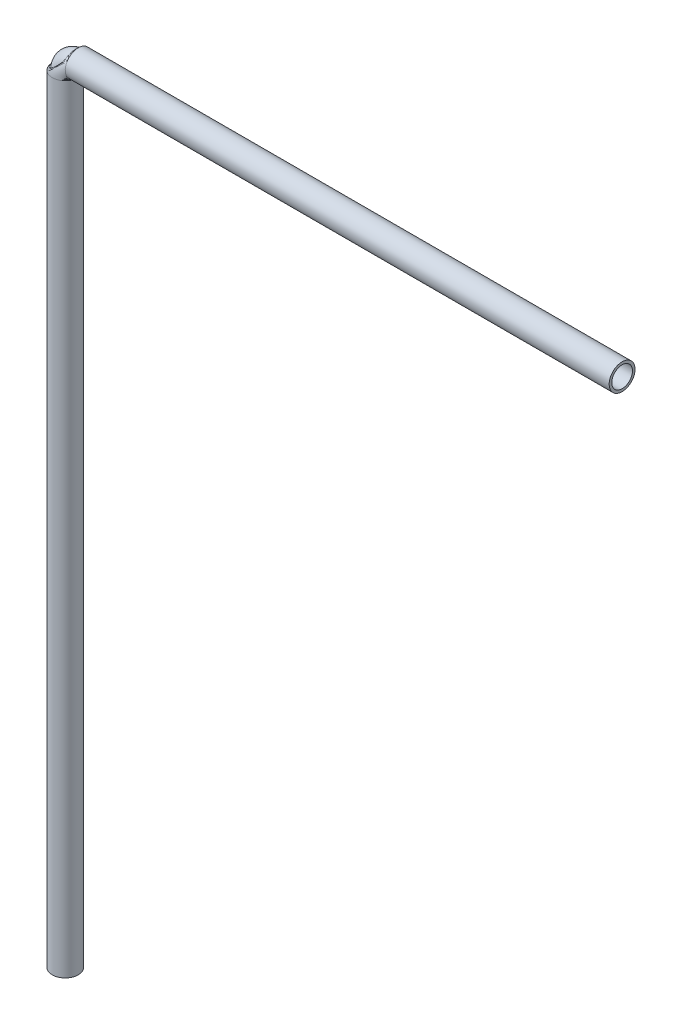
ISO-10303-21;
HEADER;
FILE_DESCRIPTION(('STEP AP214'),'2;1');
FILE_NAME('part.step','',(''),(''),'','','');
FILE_SCHEMA(('AUTOMOTIVE_DESIGN { 1 0 10303 214 1 1 1 1 }'));
ENDSEC;
DATA;
#1=APPLICATION_CONTEXT('core data for automotive mechanical design processes');
#2=APPLICATION_PROTOCOL_DEFINITION('international standard','automotive_design',2000,#1);
#3=PRODUCT_CONTEXT('',#1,'mechanical');
#4=PRODUCT('Part','Part','',(#3));
#5=PRODUCT_RELATED_PRODUCT_CATEGORY('part','',(#4));
#6=PRODUCT_DEFINITION_FORMATION('','',#4);
#7=PRODUCT_DEFINITION_CONTEXT('part definition',#1,'design');
#8=PRODUCT_DEFINITION('design','',#6,#7);
#9=PRODUCT_DEFINITION_SHAPE('','',#8);
#10=(LENGTH_UNIT() NAMED_UNIT(*) SI_UNIT(.MILLI.,.METRE.));
#11=(NAMED_UNIT(*) PLANE_ANGLE_UNIT() SI_UNIT($,.RADIAN.));
#12=(NAMED_UNIT(*) SI_UNIT($,.STERADIAN.) SOLID_ANGLE_UNIT());
#13=UNCERTAINTY_MEASURE_WITH_UNIT(LENGTH_MEASURE(1.E-05),#10,'distance_accuracy_value','');
#14=(GEOMETRIC_REPRESENTATION_CONTEXT(3) GLOBAL_UNCERTAINTY_ASSIGNED_CONTEXT((#13)) GLOBAL_UNIT_ASSIGNED_CONTEXT((#10,
#11,#12)) REPRESENTATION_CONTEXT('',''));
#15=CARTESIAN_POINT('',(0.,0.,0.));
#16=DIRECTION('',(0.,0.,1.));
#17=DIRECTION('',(1.,0.,0.));
#18=AXIS2_PLACEMENT_3D('',#15,#16,#17);
#19=CARTESIAN_POINT('',(0.,0.,0.));
#20=DIRECTION('',(0.,1.,0.));
#21=DIRECTION('',(0.,0.,1.));
#22=AXIS2_PLACEMENT_3D('',#19,#20,#21);
#23=CYLINDRICAL_SURFACE('',#22,0.5);
#24=CARTESIAN_POINT('',(0.,30.,0.));
#25=DIRECTION('',(0.,1.,0.));
#26=DIRECTION('',(0.,0.,1.));
#27=AXIS2_PLACEMENT_3D('',#24,#25,#26);
#28=CIRCLE('',#27,0.5);
#29=CARTESIAN_POINT('',(0.5,30.,0.));
#30=VERTEX_POINT('',#29);
#31=EDGE_CURVE('E65',#30,#30,#28,.T.);
#32=ORIENTED_EDGE('',*,*,#31,.F.);
#33=EDGE_LOOP('',(#32));
#34=FACE_BOUND('',#33,.T.);
#35=CARTESIAN_POINT('',(0.,0.,0.));
#36=DIRECTION('',(0.,1.,0.));
#37=DIRECTION('',(0.,0.,1.));
#38=AXIS2_PLACEMENT_3D('',#35,#36,#37);
#39=CIRCLE('',#38,0.5);
#40=CARTESIAN_POINT('',(0.,0.,0.5));
#41=VERTEX_POINT('',#40);
#42=EDGE_CURVE('E50',#41,#41,#39,.T.);
#43=ORIENTED_EDGE('',*,*,#42,.T.);
#44=EDGE_LOOP('',(#43));
#45=FACE_BOUND('',#44,.T.);
#46=ADVANCED_FACE('F35',(#34,#45),#23,.T.);
#47=CARTESIAN_POINT('',(0.5,30.,0.));
#48=DIRECTION('',(0.,0.,-1.));
#49=DIRECTION('',(-1.,0.,0.));
#50=AXIS2_PLACEMENT_3D('',#47,#48,#49);
#51=TOROIDAL_SURFACE('',#50,0.5,0.5);
#52=CARTESIAN_POINT('',(0.5,30.5,0.));
#53=DIRECTION('',(1.,0.,0.));
#54=DIRECTION('',(0.,0.,1.));
#55=AXIS2_PLACEMENT_3D('',#52,#53,#54);
#56=CIRCLE('',#55,0.5);
#57=EDGE_CURVE('E39',#30,#30,#56,.T.);
#58=ORIENTED_EDGE('',*,*,#57,.F.);
#59=ORIENTED_EDGE('',*,*,#31,.T.);
#60=EDGE_LOOP('',(#58,#59));
#61=FACE_BOUND('',#60,.T.);
#62=ADVANCED_FACE('F91',(#61),#51,.T.);
#63=CARTESIAN_POINT('',(0.5,30.5,0.));
#64=DIRECTION('',(1.,0.,0.));
#65=DIRECTION('',(0.,0.,-1.));
#66=AXIS2_PLACEMENT_3D('',#63,#64,#65);
#67=CYLINDRICAL_SURFACE('',#66,0.5);
#68=CARTESIAN_POINT('',(21.5,30.5,0.));
#69=DIRECTION('',(1.,0.,0.));
#70=DIRECTION('',(0.,0.,1.));
#71=AXIS2_PLACEMENT_3D('',#68,#69,#70);
#72=CIRCLE('',#71,0.5);
#73=CARTESIAN_POINT('',(21.5,30.5,0.5));
#74=VERTEX_POINT('',#73);
#75=EDGE_CURVE('E56',#74,#74,#72,.T.);
#76=ORIENTED_EDGE('',*,*,#75,.F.);
#77=EDGE_LOOP('',(#76));
#78=FACE_BOUND('',#77,.T.);
#79=ORIENTED_EDGE('',*,*,#57,.T.);
#80=EDGE_LOOP('',(#79));
#81=FACE_BOUND('',#80,.T.);
#82=ADVANCED_FACE('F37',(#78,#81),#67,.T.);
#83=CARTESIAN_POINT('',(0.,0.,0.));
#84=DIRECTION('',(0.,1.,0.));
#85=DIRECTION('',(0.,0.,1.));
#86=AXIS2_PLACEMENT_3D('',#83,#84,#85);
#87=PLANE('',#86);
#88=CARTESIAN_POINT('',(0.,0.,0.));
#89=DIRECTION('',(0.,1.,0.));
#90=DIRECTION('',(0.,0.,1.));
#91=AXIS2_PLACEMENT_3D('',#88,#89,#90);
#92=CIRCLE('',#91,0.4);
#93=CARTESIAN_POINT('',(0.,0.,0.4));
#94=VERTEX_POINT('',#93);
#95=EDGE_CURVE('E82',#94,#94,#92,.F.);
#96=ORIENTED_EDGE('',*,*,#95,.F.);
#97=EDGE_LOOP('',(#96));
#98=FACE_BOUND('',#97,.T.);
#99=ORIENTED_EDGE('',*,*,#42,.F.);
#100=EDGE_LOOP('',(#99));
#101=FACE_BOUND('',#100,.T.);
#102=ADVANCED_FACE('F97',(#98,#101),#87,.F.);
#103=CARTESIAN_POINT('',(21.5,30.5,0.));
#104=DIRECTION('',(1.,0.,0.));
#105=DIRECTION('',(0.,0.,1.));
#106=AXIS2_PLACEMENT_3D('',#103,#104,#105);
#107=PLANE('',#106);
#108=CARTESIAN_POINT('',(21.5,30.5,0.));
#109=DIRECTION('',(1.,0.,0.));
#110=DIRECTION('',(0.,0.,1.));
#111=AXIS2_PLACEMENT_3D('',#108,#109,#110);
#112=CIRCLE('',#111,0.4);
#113=CARTESIAN_POINT('',(21.5,30.5,0.4));
#114=VERTEX_POINT('',#113);
#115=EDGE_CURVE('E11',#114,#114,#112,.F.);
#116=ORIENTED_EDGE('',*,*,#115,.T.);
#117=EDGE_LOOP('',(#116));
#118=FACE_BOUND('',#117,.T.);
#119=ORIENTED_EDGE('',*,*,#75,.T.);
#120=EDGE_LOOP('',(#119));
#121=FACE_BOUND('',#120,.T.);
#122=ADVANCED_FACE('F68',(#118,#121),#107,.T.);
#123=CARTESIAN_POINT('',(0.,0.,0.));
#124=DIRECTION('',(0.,1.,0.));
#125=DIRECTION('',(0.,0.,1.));
#126=AXIS2_PLACEMENT_3D('',#123,#124,#125);
#127=CYLINDRICAL_SURFACE('',#126,0.4);
#128=CARTESIAN_POINT('',(0.,30.,0.));
#129=DIRECTION('',(0.,1.,0.));
#130=DIRECTION('',(0.,0.,1.));
#131=AXIS2_PLACEMENT_3D('',#128,#129,#130);
#132=CIRCLE('',#131,0.4);
#133=CARTESIAN_POINT('',(-0.4,30.,0.));
#134=VERTEX_POINT('',#133);
#135=EDGE_CURVE('E79',#134,#134,#132,.F.);
#136=ORIENTED_EDGE('',*,*,#135,.F.);
#137=EDGE_LOOP('',(#136));
#138=FACE_BOUND('',#137,.T.);
#139=ORIENTED_EDGE('',*,*,#95,.T.);
#140=EDGE_LOOP('',(#139));
#141=FACE_BOUND('',#140,.T.);
#142=ADVANCED_FACE('F104',(#138,#141),#127,.F.);
#143=CARTESIAN_POINT('',(0.5,30.,0.));
#144=DIRECTION('',(0.,0.,-1.));
#145=DIRECTION('',(-1.,0.,0.));
#146=AXIS2_PLACEMENT_3D('',#143,#144,#145);
#147=TOROIDAL_SURFACE('',#146,0.5,0.4);
#148=CARTESIAN_POINT('',(0.5,30.5,0.));
#149=DIRECTION('',(1.,0.,0.));
#150=DIRECTION('',(0.,0.,1.));
#151=AXIS2_PLACEMENT_3D('',#148,#149,#150);
#152=CIRCLE('',#151,0.4);
#153=CARTESIAN_POINT('',(0.5,30.9,0.));
#154=VERTEX_POINT('',#153);
#155=EDGE_CURVE('E44',#154,#154,#152,.F.);
#156=CARTESIAN_POINT('',(0.5,30.,0.));
#157=DIRECTION('',(0.,0.,-1.));
#158=DIRECTION('',(-1.,0.,0.));
#159=AXIS2_PLACEMENT_3D('',#156,#157,#158);
#160=CIRCLE('',#159,0.9);
#161=EDGE_CURVE('',#134,#154,#160,.T.);
#162=ORIENTED_EDGE('',*,*,#135,.T.);
#163=ORIENTED_EDGE('',*,*,#155,.F.);
#164=ORIENTED_EDGE('',*,*,#161,.T.);
#165=ORIENTED_EDGE('',*,*,#161,.F.);
#166=EDGE_LOOP('',(#162,#164,#163,#165));
#167=FACE_BOUND('',#166,.T.);
#168=ADVANCED_FACE('F74',(#167),#147,.F.);
#169=CARTESIAN_POINT('',(0.5,30.5,0.));
#170=DIRECTION('',(1.,0.,0.));
#171=DIRECTION('',(0.,0.,-1.));
#172=AXIS2_PLACEMENT_3D('',#169,#170,#171);
#173=CYLINDRICAL_SURFACE('',#172,0.4);
#174=ORIENTED_EDGE('',*,*,#115,.F.);
#175=EDGE_LOOP('',(#174));
#176=FACE_BOUND('',#175,.T.);
#177=ORIENTED_EDGE('',*,*,#155,.T.);
#178=EDGE_LOOP('',(#177));
#179=FACE_BOUND('',#178,.T.);
#180=ADVANCED_FACE('F71',(#176,#179),#173,.F.);
#181=CLOSED_SHELL('',(#46,#62,#82,#102,#122,#142,#168,#180));
#182=MANIFOLD_SOLID_BREP('B2',#181);
#183=ADVANCED_BREP_SHAPE_REPRESENTATION('',(#18,#182),#14);
#184=SHAPE_DEFINITION_REPRESENTATION(#9,#183);
ENDSEC;
END-ISO-10303-21;
